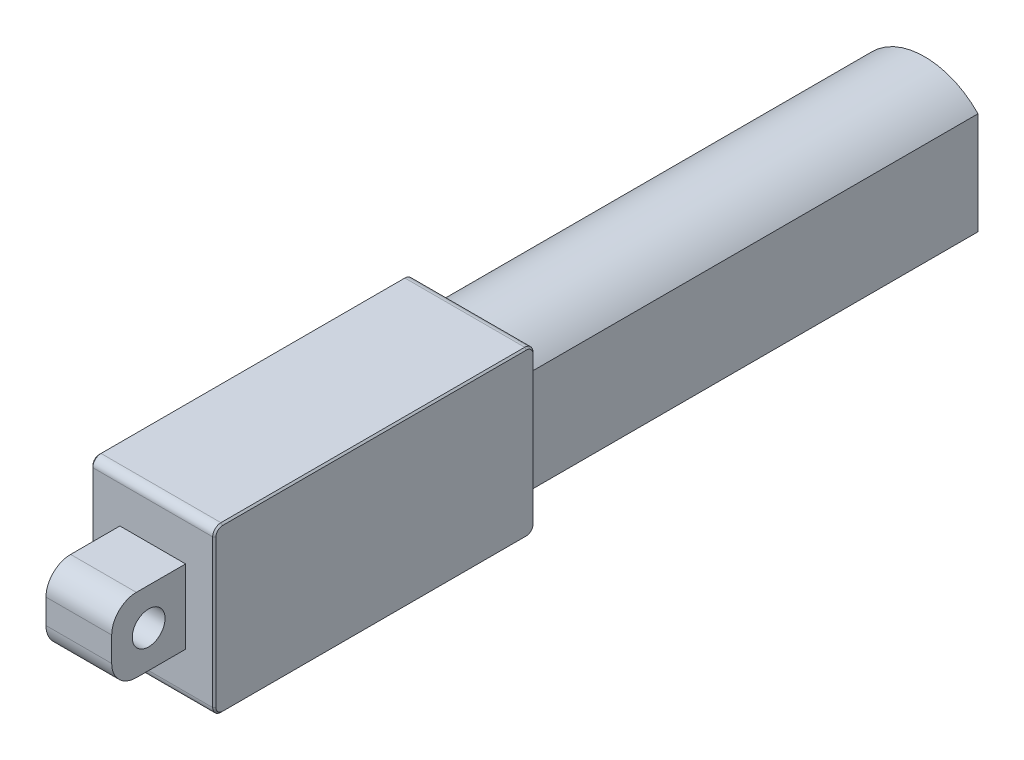
ISO-10303-21;
HEADER;
FILE_DESCRIPTION(('STEP AP214'),'2;1');
FILE_NAME('part.step','',(''),(''),'','','');
FILE_SCHEMA(('AUTOMOTIVE_DESIGN { 1 0 10303 214 1 1 1 1 }'));
ENDSEC;
DATA;
#1=APPLICATION_CONTEXT('core data for automotive mechanical design processes');
#2=APPLICATION_PROTOCOL_DEFINITION('international standard','automotive_design',2000,#1);
#3=PRODUCT_CONTEXT('',#1,'mechanical');
#4=PRODUCT('Part','Part','',(#3));
#5=PRODUCT_RELATED_PRODUCT_CATEGORY('part','',(#4));
#6=PRODUCT_DEFINITION_FORMATION('','',#4);
#7=PRODUCT_DEFINITION_CONTEXT('part definition',#1,'design');
#8=PRODUCT_DEFINITION('design','',#6,#7);
#9=PRODUCT_DEFINITION_SHAPE('','',#8);
#10=(LENGTH_UNIT() NAMED_UNIT(*) SI_UNIT(.MILLI.,.METRE.));
#11=(NAMED_UNIT(*) PLANE_ANGLE_UNIT() SI_UNIT($,.RADIAN.));
#12=(NAMED_UNIT(*) SI_UNIT($,.STERADIAN.) SOLID_ANGLE_UNIT());
#13=UNCERTAINTY_MEASURE_WITH_UNIT(LENGTH_MEASURE(1.E-05),#10,'distance_accuracy_value','');
#14=(GEOMETRIC_REPRESENTATION_CONTEXT(3) GLOBAL_UNCERTAINTY_ASSIGNED_CONTEXT((#13)) GLOBAL_UNIT_ASSIGNED_CONTEXT((#10,
#11,#12)) REPRESENTATION_CONTEXT('',''));
#15=CARTESIAN_POINT('',(0.,0.,0.));
#16=DIRECTION('',(0.,0.,1.));
#17=DIRECTION('',(1.,0.,0.));
#18=AXIS2_PLACEMENT_3D('',#15,#16,#17);
#19=CARTESIAN_POINT('',(0.,0.,-43.5));
#20=DIRECTION('',(0.,0.,1.));
#21=DIRECTION('',(0.,-1.,0.));
#22=AXIS2_PLACEMENT_3D('',#19,#20,#21);
#23=PLANE('',#22);
#24=DIRECTION('',(1.,0.,0.));
#25=VECTOR('',#24,1.);
#26=CARTESIAN_POINT('',(0.,9.,-43.5));
#27=LINE('',#26,#25);
#28=CARTESIAN_POINT('',(4.,9.,-43.5));
#29=VERTEX_POINT('',#28);
#30=CARTESIAN_POINT('',(11.3,9.,-43.5));
#31=VERTEX_POINT('',#30);
#32=EDGE_CURVE('E350',#29,#31,#27,.T.);
#33=ORIENTED_EDGE('',*,*,#32,.T.);
#34=DIRECTION('',(0.,-1.,0.));
#35=VECTOR('',#34,1.);
#36=CARTESIAN_POINT('',(11.3,0.,-43.5));
#37=LINE('',#36,#35);
#38=CARTESIAN_POINT('',(11.3,-9.,-43.5));
#39=VERTEX_POINT('',#38);
#40=EDGE_CURVE('E11',#31,#39,#37,.T.);
#41=ORIENTED_EDGE('',*,*,#40,.T.);
#42=DIRECTION('',(-1.,0.,0.));
#43=VECTOR('',#42,1.);
#44=CARTESIAN_POINT('',(0.,-9.,-43.5));
#45=LINE('',#44,#43);
#46=CARTESIAN_POINT('',(4.,-9.,-43.5));
#47=VERTEX_POINT('',#46);
#48=EDGE_CURVE('E361',#39,#47,#45,.T.);
#49=ORIENTED_EDGE('',*,*,#48,.T.);
#50=CARTESIAN_POINT('',(4.,0.,-43.5));
#51=DIRECTION('',(0.,0.,-1.));
#52=DIRECTION('',(0.,1.,0.));
#53=AXIS2_PLACEMENT_3D('',#50,#51,#52);
#54=CIRCLE('',#53,9.);
#55=CARTESIAN_POINT('',(10.5,-6.22494979899437,-43.5));
#56=VERTEX_POINT('',#55);
#57=EDGE_CURVE('E1081',#56,#47,#54,.T.);
#58=ORIENTED_EDGE('',*,*,#57,.F.);
#59=DIRECTION('',(0.,-1.,0.));
#60=VECTOR('',#59,1.);
#61=CARTESIAN_POINT('',(10.5,6.22494979899436,-43.5));
#62=LINE('',#61,#60);
#63=CARTESIAN_POINT('',(10.5,6.22494979899436,-43.5));
#64=VERTEX_POINT('',#63);
#65=EDGE_CURVE('E248',#64,#56,#62,.T.);
#66=ORIENTED_EDGE('',*,*,#65,.F.);
#67=CARTESIAN_POINT('',(4.,0.,-43.5));
#68=DIRECTION('',(0.,0.,-1.));
#69=DIRECTION('',(0.,1.,0.));
#70=AXIS2_PLACEMENT_3D('',#67,#68,#69);
#71=CIRCLE('',#70,9.);
#72=EDGE_CURVE('E1061',#29,#64,#71,.T.);
#73=ORIENTED_EDGE('',*,*,#72,.F.);
#74=EDGE_LOOP('',(#33,#41,#49,#58,#66,#73));
#75=FACE_BOUND('',#74,.T.);
#76=ADVANCED_FACE('F42',(#75),#23,.F.);
#77=DIRECTION('',(-1.,0.,0.));
#78=VECTOR('',#77,1.);
#79=CARTESIAN_POINT('',(0.,-9.,-43.5));
#80=LINE('',#79,#78);
#81=CARTESIAN_POINT('',(-3.3,-9.,-43.5));
#82=VERTEX_POINT('',#81);
#83=EDGE_CURVE('E357',#47,#82,#80,.T.);
#84=ORIENTED_EDGE('',*,*,#83,.T.);
#85=DIRECTION('',(0.,1.,0.));
#86=VECTOR('',#85,1.);
#87=CARTESIAN_POINT('',(-3.29999999999999,0.,-43.5));
#88=LINE('',#87,#86);
#89=CARTESIAN_POINT('',(-3.29999999999999,9.,-43.5));
#90=VERTEX_POINT('',#89);
#91=EDGE_CURVE('E417',#82,#90,#88,.T.);
#92=ORIENTED_EDGE('',*,*,#91,.T.);
#93=DIRECTION('',(1.,0.,0.));
#94=VECTOR('',#93,1.);
#95=CARTESIAN_POINT('',(0.,9.,-43.5));
#96=LINE('',#95,#94);
#97=EDGE_CURVE('E354',#90,#29,#96,.T.);
#98=ORIENTED_EDGE('',*,*,#97,.T.);
#99=CARTESIAN_POINT('',(-2.5,6.22494979899436,-43.5));
#100=VERTEX_POINT('',#99);
#101=EDGE_CURVE('E1058',#100,#29,#71,.T.);
#102=ORIENTED_EDGE('',*,*,#101,.F.);
#103=DIRECTION('',(0.,1.,0.));
#104=VECTOR('',#103,1.);
#105=CARTESIAN_POINT('',(-2.5,6.22494979899436,-43.5));
#106=LINE('',#105,#104);
#107=CARTESIAN_POINT('',(-2.5,-6.22494979899437,-43.5));
#108=VERTEX_POINT('',#107);
#109=EDGE_CURVE('E1069',#108,#100,#106,.T.);
#110=ORIENTED_EDGE('',*,*,#109,.F.);
#111=EDGE_CURVE('E253',#47,#108,#54,.T.);
#112=ORIENTED_EDGE('',*,*,#111,.F.);
#113=EDGE_LOOP('',(#84,#92,#98,#102,#110,#112));
#114=FACE_BOUND('',#113,.T.);
#115=ADVANCED_FACE('F575',(#114),#23,.F.);
#116=CARTESIAN_POINT('',(8.,-1.5,1.5));
#117=DIRECTION('',(-1.,0.,0.));
#118=DIRECTION('',(0.,0.,1.));
#119=AXIS2_PLACEMENT_3D('',#116,#117,#118);
#120=PLANE('',#119);
#121=CARTESIAN_POINT('',(8.,-1.5,1.5));
#122=DIRECTION('',(1.,0.,0.));
#123=DIRECTION('',(0.,0.,1.));
#124=AXIS2_PLACEMENT_3D('',#121,#122,#123);
#125=CIRCLE('',#124,3.);
#126=CARTESIAN_POINT('',(8.,-1.49999999999998,4.5));
#127=VERTEX_POINT('',#126);
#128=CARTESIAN_POINT('',(8.,-4.5,1.49999999999998));
#129=VERTEX_POINT('',#128);
#130=EDGE_CURVE('E271',#127,#129,#125,.T.);
#131=ORIENTED_EDGE('',*,*,#130,.T.);
#132=DIRECTION('',(0.,0.,-1.));
#133=VECTOR('',#132,1.);
#134=CARTESIAN_POINT('',(8.,-4.5,-4.5));
#135=LINE('',#134,#133);
#136=CARTESIAN_POINT('',(8.,-4.5,-4.5));
#137=VERTEX_POINT('',#136);
#138=EDGE_CURVE('E275',#129,#137,#135,.T.);
#139=ORIENTED_EDGE('',*,*,#138,.T.);
#140=DIRECTION('',(0.,1.,0.));
#141=VECTOR('',#140,1.);
#142=CARTESIAN_POINT('',(8.,4.5,-4.5));
#143=LINE('',#142,#141);
#144=CARTESIAN_POINT('',(8.,4.5,-4.5));
#145=VERTEX_POINT('',#144);
#146=EDGE_CURVE('E279',#137,#145,#143,.T.);
#147=ORIENTED_EDGE('',*,*,#146,.T.);
#148=DIRECTION('',(0.,0.,1.));
#149=VECTOR('',#148,1.);
#150=CARTESIAN_POINT('',(8.,4.5,0.));
#151=LINE('',#150,#149);
#152=CARTESIAN_POINT('',(8.,4.5,1.49999999999998));
#153=VERTEX_POINT('',#152);
#154=EDGE_CURVE('E282',#145,#153,#151,.T.);
#155=ORIENTED_EDGE('',*,*,#154,.T.);
#156=CARTESIAN_POINT('',(8.,1.5,1.5));
#157=DIRECTION('',(1.,0.,0.));
#158=DIRECTION('',(0.,0.,1.));
#159=AXIS2_PLACEMENT_3D('',#156,#157,#158);
#160=CIRCLE('',#159,3.);
#161=CARTESIAN_POINT('',(8.,1.49999999999998,4.5));
#162=VERTEX_POINT('',#161);
#163=EDGE_CURVE('E285',#153,#162,#160,.T.);
#164=ORIENTED_EDGE('',*,*,#163,.T.);
#165=DIRECTION('',(0.,-1.,0.));
#166=VECTOR('',#165,1.);
#167=CARTESIAN_POINT('',(8.,-1.49999999999998,4.5));
#168=LINE('',#167,#166);
#169=EDGE_CURVE('E288',#162,#127,#168,.T.);
#170=ORIENTED_EDGE('',*,*,#169,.T.);
#171=EDGE_LOOP('',(#131,#139,#147,#155,#164,#170));
#172=FACE_BOUND('',#171,.T.);
#173=CARTESIAN_POINT('',(8.,0.,0.));
#174=DIRECTION('',(1.,0.,0.));
#175=DIRECTION('',(0.,0.,-1.));
#176=AXIS2_PLACEMENT_3D('',#173,#174,#175);
#177=CIRCLE('',#176,2.);
#178=CARTESIAN_POINT('',(8.,0.,-2.));
#179=VERTEX_POINT('',#178);
#180=EDGE_CURVE('E261',#179,#179,#177,.T.);
#181=ORIENTED_EDGE('',*,*,#180,.F.);
#182=EDGE_LOOP('',(#181));
#183=FACE_BOUND('',#182,.T.);
#184=ADVANCED_FACE('F633',(#172,#183),#120,.F.);
#185=CARTESIAN_POINT('',(0.,-1.5,1.5));
#186=DIRECTION('',(-1.,0.,0.));
#187=DIRECTION('',(0.,0.,1.));
#188=AXIS2_PLACEMENT_3D('',#185,#186,#187);
#189=PLANE('',#188);
#190=CARTESIAN_POINT('',(0.,-1.5,1.5));
#191=DIRECTION('',(1.,0.,0.));
#192=DIRECTION('',(0.,0.,1.));
#193=AXIS2_PLACEMENT_3D('',#190,#191,#192);
#194=CIRCLE('',#193,3.);
#195=CARTESIAN_POINT('',(0.,-1.49999999999998,4.5));
#196=VERTEX_POINT('',#195);
#197=CARTESIAN_POINT('',(0.,-4.5,1.49999999999998));
#198=VERTEX_POINT('',#197);
#199=EDGE_CURVE('E269',#196,#198,#194,.T.);
#200=ORIENTED_EDGE('',*,*,#199,.F.);
#201=DIRECTION('',(0.,-1.,0.));
#202=VECTOR('',#201,1.);
#203=CARTESIAN_POINT('',(0.,-1.49999999999998,4.5));
#204=LINE('',#203,#202);
#205=CARTESIAN_POINT('',(0.,1.49999999999998,4.5));
#206=VERTEX_POINT('',#205);
#207=EDGE_CURVE('E276',#206,#196,#204,.T.);
#208=ORIENTED_EDGE('',*,*,#207,.F.);
#209=CARTESIAN_POINT('',(0.,1.5,1.5));
#210=DIRECTION('',(1.,0.,0.));
#211=DIRECTION('',(0.,0.,1.));
#212=AXIS2_PLACEMENT_3D('',#209,#210,#211);
#213=CIRCLE('',#212,3.);
#214=CARTESIAN_POINT('',(0.,4.5,1.49999999999998));
#215=VERTEX_POINT('',#214);
#216=EDGE_CURVE('E306',#215,#206,#213,.T.);
#217=ORIENTED_EDGE('',*,*,#216,.F.);
#218=DIRECTION('',(0.,0.,1.));
#219=VECTOR('',#218,1.);
#220=CARTESIAN_POINT('',(0.,4.5,1.49999999999998));
#221=LINE('',#220,#219);
#222=CARTESIAN_POINT('',(0.,4.5,-4.5));
#223=VERTEX_POINT('',#222);
#224=EDGE_CURVE('E303',#223,#215,#221,.T.);
#225=ORIENTED_EDGE('',*,*,#224,.F.);
#226=DIRECTION('',(0.,1.,0.));
#227=VECTOR('',#226,1.);
#228=CARTESIAN_POINT('',(0.,4.5,-4.5));
#229=LINE('',#228,#227);
#230=CARTESIAN_POINT('',(0.,-4.5,-4.5));
#231=VERTEX_POINT('',#230);
#232=EDGE_CURVE('E299',#231,#223,#229,.T.);
#233=ORIENTED_EDGE('',*,*,#232,.F.);
#234=DIRECTION('',(0.,0.,-1.));
#235=VECTOR('',#234,1.);
#236=CARTESIAN_POINT('',(0.,-4.5,-4.5));
#237=LINE('',#236,#235);
#238=EDGE_CURVE('E295',#198,#231,#237,.T.);
#239=ORIENTED_EDGE('',*,*,#238,.F.);
#240=EDGE_LOOP('',(#200,#208,#217,#225,#233,#239));
#241=FACE_BOUND('',#240,.T.);
#242=CARTESIAN_POINT('',(0.,0.,0.));
#243=DIRECTION('',(1.,0.,0.));
#244=DIRECTION('',(0.,0.,-1.));
#245=AXIS2_PLACEMENT_3D('',#242,#243,#244);
#246=CIRCLE('',#245,2.);
#247=CARTESIAN_POINT('',(0.,0.,-2.));
#248=VERTEX_POINT('',#247);
#249=EDGE_CURVE('E256',#248,#248,#246,.T.);
#250=ORIENTED_EDGE('',*,*,#249,.T.);
#251=EDGE_LOOP('',(#250));
#252=FACE_BOUND('',#251,.T.);
#253=ADVANCED_FACE('F655',(#241,#252),#189,.T.);
#254=CARTESIAN_POINT('',(8.,-1.5,1.5));
#255=DIRECTION('',(-1.,0.,0.));
#256=DIRECTION('',(0.,0.,1.));
#257=AXIS2_PLACEMENT_3D('',#254,#255,#256);
#258=CYLINDRICAL_SURFACE('',#257,3.);
#259=ORIENTED_EDGE('',*,*,#199,.T.);
#260=DIRECTION('',(-1.,0.,0.));
#261=VECTOR('',#260,1.);
#262=CARTESIAN_POINT('',(8.,-4.5,1.49999999999998));
#263=LINE('',#262,#261);
#264=EDGE_CURVE('E330',#129,#198,#263,.T.);
#265=ORIENTED_EDGE('',*,*,#264,.F.);
#266=ORIENTED_EDGE('',*,*,#130,.F.);
#267=DIRECTION('',(-1.,0.,0.));
#268=VECTOR('',#267,1.);
#269=CARTESIAN_POINT('',(8.,-1.49999999999998,4.5));
#270=LINE('',#269,#268);
#271=EDGE_CURVE('E291',#127,#196,#270,.T.);
#272=ORIENTED_EDGE('',*,*,#271,.T.);
#273=EDGE_LOOP('',(#259,#265,#266,#272));
#274=FACE_BOUND('',#273,.T.);
#275=ADVANCED_FACE('F659',(#274),#258,.T.);
#276=CARTESIAN_POINT('',(8.,-4.5,-4.5));
#277=DIRECTION('',(0.,1.,0.));
#278=DIRECTION('',(0.,0.,1.));
#279=AXIS2_PLACEMENT_3D('',#276,#277,#278);
#280=PLANE('',#279);
#281=ORIENTED_EDGE('',*,*,#238,.T.);
#282=DIRECTION('',(-1.,0.,0.));
#283=VECTOR('',#282,1.);
#284=CARTESIAN_POINT('',(8.,-4.5,-4.5));
#285=LINE('',#284,#283);
#286=EDGE_CURVE('E326',#137,#231,#285,.T.);
#287=ORIENTED_EDGE('',*,*,#286,.F.);
#288=ORIENTED_EDGE('',*,*,#138,.F.);
#289=ORIENTED_EDGE('',*,*,#264,.T.);
#290=EDGE_LOOP('',(#281,#287,#288,#289));
#291=FACE_BOUND('',#290,.T.);
#292=ADVANCED_FACE('F671',(#291),#280,.F.);
#293=CARTESIAN_POINT('',(8.,4.5,1.49999999999998));
#294=DIRECTION('',(0.,-1.,0.));
#295=DIRECTION('',(0.,0.,-1.));
#296=AXIS2_PLACEMENT_3D('',#293,#294,#295);
#297=PLANE('',#296);
#298=ORIENTED_EDGE('',*,*,#224,.T.);
#299=DIRECTION('',(-1.,0.,0.));
#300=VECTOR('',#299,1.);
#301=CARTESIAN_POINT('',(8.,4.5,1.49999999999998));
#302=LINE('',#301,#300);
#303=EDGE_CURVE('E318',#153,#215,#302,.T.);
#304=ORIENTED_EDGE('',*,*,#303,.F.);
#305=ORIENTED_EDGE('',*,*,#154,.F.);
#306=DIRECTION('',(-1.,0.,0.));
#307=VECTOR('',#306,1.);
#308=CARTESIAN_POINT('',(8.,4.5,-4.5));
#309=LINE('',#308,#307);
#310=EDGE_CURVE('E322',#145,#223,#309,.T.);
#311=ORIENTED_EDGE('',*,*,#310,.T.);
#312=EDGE_LOOP('',(#298,#304,#305,#311));
#313=FACE_BOUND('',#312,.T.);
#314=ADVANCED_FACE('F667',(#313),#297,.F.);
#315=CARTESIAN_POINT('',(8.,1.5,1.5));
#316=DIRECTION('',(-1.,0.,0.));
#317=DIRECTION('',(0.,0.,1.));
#318=AXIS2_PLACEMENT_3D('',#315,#316,#317);
#319=CYLINDRICAL_SURFACE('',#318,3.);
#320=ORIENTED_EDGE('',*,*,#216,.T.);
#321=DIRECTION('',(-1.,0.,0.));
#322=VECTOR('',#321,1.);
#323=CARTESIAN_POINT('',(8.,1.49999999999998,4.5));
#324=LINE('',#323,#322);
#325=EDGE_CURVE('E314',#162,#206,#324,.T.);
#326=ORIENTED_EDGE('',*,*,#325,.F.);
#327=ORIENTED_EDGE('',*,*,#163,.F.);
#328=ORIENTED_EDGE('',*,*,#303,.T.);
#329=EDGE_LOOP('',(#320,#326,#327,#328));
#330=FACE_BOUND('',#329,.T.);
#331=ADVANCED_FACE('F663',(#330),#319,.T.);
#332=CARTESIAN_POINT('',(8.,-1.49999999999998,4.5));
#333=DIRECTION('',(0.,0.,-1.));
#334=DIRECTION('',(-1.,0.,0.));
#335=AXIS2_PLACEMENT_3D('',#332,#333,#334);
#336=PLANE('',#335);
#337=ORIENTED_EDGE('',*,*,#207,.T.);
#338=ORIENTED_EDGE('',*,*,#271,.F.);
#339=ORIENTED_EDGE('',*,*,#169,.F.);
#340=ORIENTED_EDGE('',*,*,#325,.T.);
#341=EDGE_LOOP('',(#337,#338,#339,#340));
#342=FACE_BOUND('',#341,.T.);
#343=ADVANCED_FACE('F651',(#342),#336,.F.);
#344=CARTESIAN_POINT('',(8.,0.,0.));
#345=DIRECTION('',(-1.,0.,0.));
#346=DIRECTION('',(0.,0.,1.));
#347=AXIS2_PLACEMENT_3D('',#344,#345,#346);
#348=CYLINDRICAL_SURFACE('',#347,2.);
#349=ORIENTED_EDGE('',*,*,#180,.T.);
#350=EDGE_LOOP('',(#349));
#351=FACE_BOUND('',#350,.T.);
#352=ORIENTED_EDGE('',*,*,#249,.F.);
#353=EDGE_LOOP('',(#352));
#354=FACE_BOUND('',#353,.T.);
#355=ADVANCED_FACE('F648',(#351,#354),#348,.F.);
#356=CARTESIAN_POINT('',(11.5,-10.,-43.5));
#357=DIRECTION('',(-1.,0.,0.));
#358=DIRECTION('',(0.,0.,1.));
#359=AXIS2_PLACEMENT_3D('',#356,#357,#358);
#360=PLANE('',#359);
#361=CARTESIAN_POINT('',(11.5,-9.00000000000001,-5.5));
#362=DIRECTION('',(-1.,0.,0.));
#363=DIRECTION('',(0.,0.,1.));
#364=AXIS2_PLACEMENT_3D('',#361,#362,#363);
#365=CIRCLE('',#364,0.799999999999993);
#366=CARTESIAN_POINT('',(11.5,-9.00000000000001,-4.7));
#367=VERTEX_POINT('',#366);
#368=CARTESIAN_POINT('',(11.5,-9.8,-5.5));
#369=VERTEX_POINT('',#368);
#370=EDGE_CURVE('E69',#367,#369,#365,.F.);
#371=ORIENTED_EDGE('',*,*,#370,.T.);
#372=DIRECTION('',(0.,0.,-1.));
#373=VECTOR('',#372,1.);
#374=CARTESIAN_POINT('',(11.5,-9.79999999999999,-43.5));
#375=LINE('',#374,#373);
#376=CARTESIAN_POINT('',(11.5,-9.8,-42.5));
#377=VERTEX_POINT('',#376);
#378=EDGE_CURVE('E53',#369,#377,#375,.T.);
#379=ORIENTED_EDGE('',*,*,#378,.T.);
#380=CARTESIAN_POINT('',(11.5,-9.,-42.5));
#381=DIRECTION('',(-1.,0.,0.));
#382=DIRECTION('',(0.,0.,1.));
#383=AXIS2_PLACEMENT_3D('',#380,#381,#382);
#384=CIRCLE('',#383,0.799999999999995);
#385=CARTESIAN_POINT('',(11.5,-9.,-43.3));
#386=VERTEX_POINT('',#385);
#387=EDGE_CURVE('E461',#377,#386,#384,.F.);
#388=ORIENTED_EDGE('',*,*,#387,.T.);
#389=DIRECTION('',(0.,1.,0.));
#390=VECTOR('',#389,1.);
#391=CARTESIAN_POINT('',(11.5,-10.,-43.3));
#392=LINE('',#391,#390);
#393=CARTESIAN_POINT('',(11.5,9.,-43.3));
#394=VERTEX_POINT('',#393);
#395=EDGE_CURVE('E456',#386,#394,#392,.T.);
#396=ORIENTED_EDGE('',*,*,#395,.T.);
#397=CARTESIAN_POINT('',(11.5,9.,-42.5));
#398=DIRECTION('',(-1.,0.,0.));
#399=DIRECTION('',(0.,0.,1.));
#400=AXIS2_PLACEMENT_3D('',#397,#398,#399);
#401=CIRCLE('',#400,0.799999999999995);
#402=CARTESIAN_POINT('',(11.5,9.8,-42.5));
#403=VERTEX_POINT('',#402);
#404=EDGE_CURVE('E450',#394,#403,#401,.F.);
#405=ORIENTED_EDGE('',*,*,#404,.T.);
#406=DIRECTION('',(0.,0.,1.));
#407=VECTOR('',#406,1.);
#408=CARTESIAN_POINT('',(11.5,9.8,-43.5));
#409=LINE('',#408,#407);
#410=CARTESIAN_POINT('',(11.5,9.79999999999999,-5.5));
#411=VERTEX_POINT('',#410);
#412=EDGE_CURVE('E444',#403,#411,#409,.T.);
#413=ORIENTED_EDGE('',*,*,#412,.T.);
#414=CARTESIAN_POINT('',(11.5,9.,-5.5));
#415=DIRECTION('',(-1.,0.,0.));
#416=DIRECTION('',(0.,0.,1.));
#417=AXIS2_PLACEMENT_3D('',#414,#415,#416);
#418=CIRCLE('',#417,0.799999999999994);
#419=CARTESIAN_POINT('',(11.5,9.,-4.7));
#420=VERTEX_POINT('',#419);
#421=EDGE_CURVE('E447',#411,#420,#418,.F.);
#422=ORIENTED_EDGE('',*,*,#421,.T.);
#423=DIRECTION('',(0.,-1.,0.));
#424=VECTOR('',#423,1.);
#425=CARTESIAN_POINT('',(11.5,-9.00000000000001,-4.7));
#426=LINE('',#425,#424);
#427=EDGE_CURVE('E453',#420,#367,#426,.T.);
#428=ORIENTED_EDGE('',*,*,#427,.T.);
#429=EDGE_LOOP('',(#371,#379,#388,#396,#405,#413,#422,#428));
#430=FACE_BOUND('',#429,.T.);
#431=ADVANCED_FACE('F535',(#430),#360,.F.);
#432=CARTESIAN_POINT('',(-3.5,-10.,-43.5));
#433=DIRECTION('',(0.,1.,0.));
#434=DIRECTION('',(0.,0.,1.));
#435=AXIS2_PLACEMENT_3D('',#432,#433,#434);
#436=PLANE('',#435);
#437=DIRECTION('',(-1.,0.,0.));
#438=VECTOR('',#437,1.);
#439=CARTESIAN_POINT('',(-3.5,-10.,-5.5));
#440=LINE('',#439,#438);
#441=CARTESIAN_POINT('',(11.3,-10.,-5.5));
#442=VERTEX_POINT('',#441);
#443=CARTESIAN_POINT('',(-3.3,-10.,-5.5));
#444=VERTEX_POINT('',#443);
#445=EDGE_CURVE('E338',#442,#444,#440,.T.);
#446=ORIENTED_EDGE('',*,*,#445,.T.);
#447=DIRECTION('',(0.,0.,-1.));
#448=VECTOR('',#447,1.);
#449=CARTESIAN_POINT('',(-3.3,-10.,-43.5));
#450=LINE('',#449,#448);
#451=CARTESIAN_POINT('',(-3.3,-10.,-42.5));
#452=VERTEX_POINT('',#451);
#453=EDGE_CURVE('E401',#444,#452,#450,.T.);
#454=ORIENTED_EDGE('',*,*,#453,.T.);
#455=DIRECTION('',(-1.,0.,0.));
#456=VECTOR('',#455,1.);
#457=CARTESIAN_POINT('',(-3.5,-10.,-42.5));
#458=LINE('',#457,#456);
#459=CARTESIAN_POINT('',(11.3,-10.,-42.5));
#460=VERTEX_POINT('',#459);
#461=EDGE_CURVE('E334',#452,#460,#458,.F.);
#462=ORIENTED_EDGE('',*,*,#461,.T.);
#463=DIRECTION('',(0.,0.,1.));
#464=VECTOR('',#463,1.);
#465=CARTESIAN_POINT('',(11.3,-10.,-43.5));
#466=LINE('',#465,#464);
#467=EDGE_CURVE('E397',#460,#442,#466,.T.);
#468=ORIENTED_EDGE('',*,*,#467,.T.);
#469=EDGE_LOOP('',(#446,#454,#462,#468));
#470=FACE_BOUND('',#469,.T.);
#471=ADVANCED_FACE('F551',(#470),#436,.F.);
#472=CARTESIAN_POINT('',(-3.5,10.,-43.5));
#473=DIRECTION('',(1.,0.,0.));
#474=DIRECTION('',(0.,1.,0.));
#475=AXIS2_PLACEMENT_3D('',#472,#473,#474);
#476=PLANE('',#475);
#477=CARTESIAN_POINT('',(-3.5,-9.,-42.5));
#478=DIRECTION('',(1.,0.,0.));
#479=DIRECTION('',(0.,1.,0.));
#480=AXIS2_PLACEMENT_3D('',#477,#478,#479);
#481=CIRCLE('',#480,0.799999999999993);
#482=CARTESIAN_POINT('',(-3.5,-9.,-43.3));
#483=VERTEX_POINT('',#482);
#484=CARTESIAN_POINT('',(-3.5,-9.79999999999999,-42.5));
#485=VERTEX_POINT('',#484);
#486=EDGE_CURVE('E390',#483,#485,#481,.F.);
#487=ORIENTED_EDGE('',*,*,#486,.T.);
#488=DIRECTION('',(0.,0.,1.));
#489=VECTOR('',#488,1.);
#490=CARTESIAN_POINT('',(-3.5,-9.8,-43.5));
#491=LINE('',#490,#489);
#492=CARTESIAN_POINT('',(-3.5,-9.8,-5.5));
#493=VERTEX_POINT('',#492);
#494=EDGE_CURVE('E393',#485,#493,#491,.T.);
#495=ORIENTED_EDGE('',*,*,#494,.T.);
#496=CARTESIAN_POINT('',(-3.5,-9.00000000000001,-5.5));
#497=DIRECTION('',(1.,0.,0.));
#498=DIRECTION('',(0.,1.,0.));
#499=AXIS2_PLACEMENT_3D('',#496,#497,#498);
#500=CIRCLE('',#499,0.799999999999994);
#501=CARTESIAN_POINT('',(-3.5,-9.00000000000001,-4.70000000000001));
#502=VERTEX_POINT('',#501);
#503=EDGE_CURVE('E387',#493,#502,#500,.F.);
#504=ORIENTED_EDGE('',*,*,#503,.T.);
#505=DIRECTION('',(0.,1.,0.));
#506=VECTOR('',#505,1.);
#507=CARTESIAN_POINT('',(-3.5,9.,-4.70000000000001));
#508=LINE('',#507,#506);
#509=CARTESIAN_POINT('',(-3.5,9.,-4.7));
#510=VERTEX_POINT('',#509);
#511=EDGE_CURVE('E381',#502,#510,#508,.T.);
#512=ORIENTED_EDGE('',*,*,#511,.T.);
#513=CARTESIAN_POINT('',(-3.5,9.,-5.5));
#514=DIRECTION('',(1.,0.,0.));
#515=DIRECTION('',(0.,1.,0.));
#516=AXIS2_PLACEMENT_3D('',#513,#514,#515);
#517=CIRCLE('',#516,0.799999999999995);
#518=CARTESIAN_POINT('',(-3.5,9.79999999999999,-5.5));
#519=VERTEX_POINT('',#518);
#520=EDGE_CURVE('E375',#510,#519,#517,.F.);
#521=ORIENTED_EDGE('',*,*,#520,.T.);
#522=DIRECTION('',(0.,0.,-1.));
#523=VECTOR('',#522,1.);
#524=CARTESIAN_POINT('',(-3.5,9.8,-43.5));
#525=LINE('',#524,#523);
#526=CARTESIAN_POINT('',(-3.5,9.8,-42.5));
#527=VERTEX_POINT('',#526);
#528=EDGE_CURVE('E372',#519,#527,#525,.T.);
#529=ORIENTED_EDGE('',*,*,#528,.T.);
#530=CARTESIAN_POINT('',(-3.5,9.,-42.5));
#531=DIRECTION('',(1.,0.,0.));
#532=DIRECTION('',(0.,1.,0.));
#533=AXIS2_PLACEMENT_3D('',#530,#531,#532);
#534=CIRCLE('',#533,0.799999999999995);
#535=CARTESIAN_POINT('',(-3.5,9.,-43.3));
#536=VERTEX_POINT('',#535);
#537=EDGE_CURVE('E378',#527,#536,#534,.F.);
#538=ORIENTED_EDGE('',*,*,#537,.T.);
#539=DIRECTION('',(0.,-1.,0.));
#540=VECTOR('',#539,1.);
#541=CARTESIAN_POINT('',(-3.5,10.,-43.3));
#542=LINE('',#541,#540);
#543=EDGE_CURVE('E384',#536,#483,#542,.T.);
#544=ORIENTED_EDGE('',*,*,#543,.T.);
#545=EDGE_LOOP('',(#487,#495,#504,#512,#521,#529,#538,#544));
#546=FACE_BOUND('',#545,.T.);
#547=ADVANCED_FACE('F567',(#546),#476,.F.);
#548=CARTESIAN_POINT('',(4.,10.,-43.5));
#549=DIRECTION('',(0.,-1.,0.));
#550=DIRECTION('',(0.,0.,-1.));
#551=AXIS2_PLACEMENT_3D('',#548,#549,#550);
#552=PLANE('',#551);
#553=DIRECTION('',(1.,0.,0.));
#554=VECTOR('',#553,1.);
#555=CARTESIAN_POINT('',(4.,10.,-42.5));
#556=LINE('',#555,#554);
#557=CARTESIAN_POINT('',(11.3,10.,-42.5));
#558=VERTEX_POINT('',#557);
#559=CARTESIAN_POINT('',(-3.29999999999999,10.,-42.5));
#560=VERTEX_POINT('',#559);
#561=EDGE_CURVE('E368',#558,#560,#556,.F.);
#562=ORIENTED_EDGE('',*,*,#561,.T.);
#563=DIRECTION('',(0.,0.,1.));
#564=VECTOR('',#563,1.);
#565=CARTESIAN_POINT('',(-3.29999999999999,10.,-43.5));
#566=LINE('',#565,#564);
#567=CARTESIAN_POINT('',(-3.29999999999999,10.,-5.5));
#568=VERTEX_POINT('',#567);
#569=EDGE_CURVE('E441',#560,#568,#566,.T.);
#570=ORIENTED_EDGE('',*,*,#569,.T.);
#571=DIRECTION('',(1.,0.,0.));
#572=VECTOR('',#571,1.);
#573=CARTESIAN_POINT('',(11.5,10.,-5.5));
#574=LINE('',#573,#572);
#575=CARTESIAN_POINT('',(11.3,10.,-5.5));
#576=VERTEX_POINT('',#575);
#577=EDGE_CURVE('E364',#568,#576,#574,.T.);
#578=ORIENTED_EDGE('',*,*,#577,.T.);
#579=DIRECTION('',(0.,0.,-1.));
#580=VECTOR('',#579,1.);
#581=CARTESIAN_POINT('',(11.3,10.,-43.5));
#582=LINE('',#581,#580);
#583=EDGE_CURVE('E438',#576,#558,#582,.T.);
#584=ORIENTED_EDGE('',*,*,#583,.T.);
#585=EDGE_LOOP('',(#562,#570,#578,#584));
#586=FACE_BOUND('',#585,.T.);
#587=ADVANCED_FACE('F591',(#586),#552,.F.);
#588=CARTESIAN_POINT('',(0.,0.,-4.5));
#589=DIRECTION('',(0.,0.,1.));
#590=DIRECTION('',(0.,-1.,0.));
#591=AXIS2_PLACEMENT_3D('',#588,#589,#590);
#592=PLANE('',#591);
#593=ORIENTED_EDGE('',*,*,#286,.T.);
#594=ORIENTED_EDGE('',*,*,#232,.T.);
#595=ORIENTED_EDGE('',*,*,#310,.F.);
#596=ORIENTED_EDGE('',*,*,#146,.F.);
#597=EDGE_LOOP('',(#593,#594,#595,#596));
#598=FACE_BOUND('',#597,.T.);
#599=DIRECTION('',(1.,0.,0.));
#600=VECTOR('',#599,1.);
#601=CARTESIAN_POINT('',(-3.5,9.,-4.5));
#602=LINE('',#601,#600);
#603=CARTESIAN_POINT('',(11.3,9.,-4.5));
#604=VERTEX_POINT('',#603);
#605=CARTESIAN_POINT('',(-3.29999999999999,9.,-4.5));
#606=VERTEX_POINT('',#605);
#607=EDGE_CURVE('E342',#604,#606,#602,.F.);
#608=ORIENTED_EDGE('',*,*,#607,.T.);
#609=DIRECTION('',(0.,-1.,0.));
#610=VECTOR('',#609,1.);
#611=CARTESIAN_POINT('',(-3.3,-9.00000000000001,-4.5));
#612=LINE('',#611,#610);
#613=CARTESIAN_POINT('',(-3.3,-9.00000000000001,-4.5));
#614=VERTEX_POINT('',#613);
#615=EDGE_CURVE('E423',#606,#614,#612,.T.);
#616=ORIENTED_EDGE('',*,*,#615,.T.);
#617=DIRECTION('',(-1.,0.,0.));
#618=VECTOR('',#617,1.);
#619=CARTESIAN_POINT('',(11.5,-9.00000000000001,-4.5));
#620=LINE('',#619,#618);
#621=CARTESIAN_POINT('',(11.3,-9.00000000000001,-4.5));
#622=VERTEX_POINT('',#621);
#623=EDGE_CURVE('E346',#614,#622,#620,.F.);
#624=ORIENTED_EDGE('',*,*,#623,.T.);
#625=DIRECTION('',(0.,1.,0.));
#626=VECTOR('',#625,1.);
#627=CARTESIAN_POINT('',(11.3,9.,-4.5));
#628=LINE('',#627,#626);
#629=EDGE_CURVE('E420',#622,#604,#628,.T.);
#630=ORIENTED_EDGE('',*,*,#629,.T.);
#631=EDGE_LOOP('',(#608,#616,#624,#630));
#632=FACE_BOUND('',#631,.T.);
#633=ADVANCED_FACE('F607',(#598,#632),#592,.T.);
#634=CARTESIAN_POINT('',(4.,0.,-98.5));
#635=DIRECTION('',(0.,0.,1.));
#636=DIRECTION('',(0.,-1.,0.));
#637=AXIS2_PLACEMENT_3D('',#634,#635,#636);
#638=CYLINDRICAL_SURFACE('',#637,9.);
#639=ORIENTED_EDGE('',*,*,#57,.T.);
#640=ORIENTED_EDGE('',*,*,#111,.T.);
#641=DIRECTION('',(0.,0.,1.));
#642=VECTOR('',#641,1.);
#643=CARTESIAN_POINT('',(-2.5,-6.22494979899437,-98.5));
#644=LINE('',#643,#642);
#645=CARTESIAN_POINT('',(-2.5,-6.22494979899437,-98.5));
#646=VERTEX_POINT('',#645);
#647=EDGE_CURVE('E231',#646,#108,#644,.T.);
#648=ORIENTED_EDGE('',*,*,#647,.F.);
#649=CARTESIAN_POINT('',(4.,0.,-98.5));
#650=DIRECTION('',(0.,0.,-1.));
#651=DIRECTION('',(0.,1.,0.));
#652=AXIS2_PLACEMENT_3D('',#649,#650,#651);
#653=CIRCLE('',#652,9.);
#654=CARTESIAN_POINT('',(10.5,-6.22494979899436,-98.5));
#655=VERTEX_POINT('',#654);
#656=EDGE_CURVE('E238',#655,#646,#653,.T.);
#657=ORIENTED_EDGE('',*,*,#656,.F.);
#658=DIRECTION('',(0.,0.,1.));
#659=VECTOR('',#658,1.);
#660=CARTESIAN_POINT('',(10.5,-6.22494979899436,-98.5));
#661=LINE('',#660,#659);
#662=EDGE_CURVE('E1073',#655,#56,#661,.T.);
#663=ORIENTED_EDGE('',*,*,#662,.T.);
#664=EDGE_LOOP('',(#639,#640,#648,#657,#663));
#665=FACE_BOUND('',#664,.T.);
#666=ADVANCED_FACE('F251',(#665),#638,.T.);
#667=CARTESIAN_POINT('',(-2.5,6.22494979899437,-98.5));
#668=DIRECTION('',(1.,0.,0.));
#669=DIRECTION('',(0.,0.,-1.));
#670=AXIS2_PLACEMENT_3D('',#667,#668,#669);
#671=PLANE('',#670);
#672=ORIENTED_EDGE('',*,*,#109,.T.);
#673=DIRECTION('',(0.,0.,1.));
#674=VECTOR('',#673,1.);
#675=CARTESIAN_POINT('',(-2.5,6.22494979899437,-98.5));
#676=LINE('',#675,#674);
#677=CARTESIAN_POINT('',(-2.5,6.22494979899437,-98.5));
#678=VERTEX_POINT('',#677);
#679=EDGE_CURVE('E233',#678,#100,#676,.T.);
#680=ORIENTED_EDGE('',*,*,#679,.F.);
#681=DIRECTION('',(0.,1.,0.));
#682=VECTOR('',#681,1.);
#683=CARTESIAN_POINT('',(-2.5,6.22494979899437,-98.5));
#684=LINE('',#683,#682);
#685=EDGE_CURVE('E226',#646,#678,#684,.T.);
#686=ORIENTED_EDGE('',*,*,#685,.F.);
#687=ORIENTED_EDGE('',*,*,#647,.T.);
#688=EDGE_LOOP('',(#672,#680,#686,#687));
#689=FACE_BOUND('',#688,.T.);
#690=ADVANCED_FACE('F229',(#689),#671,.F.);
#691=CARTESIAN_POINT('',(4.,0.,-98.5));
#692=DIRECTION('',(0.,0.,1.));
#693=DIRECTION('',(0.,-1.,0.));
#694=AXIS2_PLACEMENT_3D('',#691,#692,#693);
#695=CYLINDRICAL_SURFACE('',#694,9.);
#696=ORIENTED_EDGE('',*,*,#101,.T.);
#697=ORIENTED_EDGE('',*,*,#72,.T.);
#698=DIRECTION('',(0.,0.,1.));
#699=VECTOR('',#698,1.);
#700=CARTESIAN_POINT('',(10.5,6.22494979899437,-98.5));
#701=LINE('',#700,#699);
#702=CARTESIAN_POINT('',(10.5,6.22494979899437,-98.5));
#703=VERTEX_POINT('',#702);
#704=EDGE_CURVE('E263',#703,#64,#701,.T.);
#705=ORIENTED_EDGE('',*,*,#704,.F.);
#706=CARTESIAN_POINT('',(4.,0.,-98.5));
#707=DIRECTION('',(0.,0.,-1.));
#708=DIRECTION('',(0.,1.,0.));
#709=AXIS2_PLACEMENT_3D('',#706,#707,#708);
#710=CIRCLE('',#709,9.);
#711=EDGE_CURVE('E237',#678,#703,#710,.T.);
#712=ORIENTED_EDGE('',*,*,#711,.F.);
#713=ORIENTED_EDGE('',*,*,#679,.T.);
#714=EDGE_LOOP('',(#696,#697,#705,#712,#713));
#715=FACE_BOUND('',#714,.T.);
#716=ADVANCED_FACE('F899',(#715),#695,.T.);
#717=CARTESIAN_POINT('',(10.5,6.22494979899437,-98.5));
#718=DIRECTION('',(-1.,0.,0.));
#719=DIRECTION('',(0.,0.,1.));
#720=AXIS2_PLACEMENT_3D('',#717,#718,#719);
#721=PLANE('',#720);
#722=ORIENTED_EDGE('',*,*,#65,.T.);
#723=ORIENTED_EDGE('',*,*,#662,.F.);
#724=DIRECTION('',(0.,-1.,0.));
#725=VECTOR('',#724,1.);
#726=CARTESIAN_POINT('',(10.5,6.22494979899437,-98.5));
#727=LINE('',#726,#725);
#728=EDGE_CURVE('E243',#703,#655,#727,.T.);
#729=ORIENTED_EDGE('',*,*,#728,.F.);
#730=ORIENTED_EDGE('',*,*,#704,.T.);
#731=EDGE_LOOP('',(#722,#723,#729,#730));
#732=FACE_BOUND('',#731,.T.);
#733=ADVANCED_FACE('F889',(#732),#721,.F.);
#734=CARTESIAN_POINT('',(4.,0.,-98.5));
#735=DIRECTION('',(0.,0.,-1.));
#736=DIRECTION('',(0.,1.,0.));
#737=AXIS2_PLACEMENT_3D('',#734,#735,#736);
#738=PLANE('',#737);
#739=CARTESIAN_POINT('',(4.,0.,-98.5));
#740=DIRECTION('',(0.,0.,-1.));
#741=DIRECTION('',(0.,1.,0.));
#742=AXIS2_PLACEMENT_3D('',#739,#740,#741);
#743=CIRCLE('',#742,4.5);
#744=CARTESIAN_POINT('',(4.,4.5,-98.5));
#745=VERTEX_POINT('',#744);
#746=EDGE_CURVE('E496',#745,#745,#743,.T.);
#747=ORIENTED_EDGE('',*,*,#746,.F.);
#748=EDGE_LOOP('',(#747));
#749=FACE_BOUND('',#748,.T.);
#750=ORIENTED_EDGE('',*,*,#656,.T.);
#751=ORIENTED_EDGE('',*,*,#685,.T.);
#752=ORIENTED_EDGE('',*,*,#711,.T.);
#753=ORIENTED_EDGE('',*,*,#728,.T.);
#754=EDGE_LOOP('',(#750,#751,#752,#753));
#755=FACE_BOUND('',#754,.T.);
#756=ADVANCED_FACE('F241',(#749,#755),#738,.T.);
#757=CARTESIAN_POINT('',(4.,0.,-43.5));
#758=DIRECTION('',(0.,0.,-1.));
#759=DIRECTION('',(0.,1.,0.));
#760=AXIS2_PLACEMENT_3D('',#757,#758,#759);
#761=CYLINDRICAL_SURFACE('',#760,4.5);
#762=CARTESIAN_POINT('',(4.,0.,-43.5));
#763=DIRECTION('',(0.,0.,-1.));
#764=DIRECTION('',(0.,1.,0.));
#765=AXIS2_PLACEMENT_3D('',#762,#763,#764);
#766=CIRCLE('',#765,4.5);
#767=CARTESIAN_POINT('',(4.,4.5,-43.5));
#768=VERTEX_POINT('',#767);
#769=EDGE_CURVE('E1085',#768,#768,#766,.T.);
#770=ORIENTED_EDGE('',*,*,#769,.F.);
#771=EDGE_LOOP('',(#770));
#772=FACE_BOUND('',#771,.T.);
#773=ORIENTED_EDGE('',*,*,#746,.T.);
#774=EDGE_LOOP('',(#773));
#775=FACE_BOUND('',#774,.T.);
#776=ADVANCED_FACE('F870',(#772,#775),#761,.F.);
#777=CARTESIAN_POINT('',(4.,0.,-43.5));
#778=DIRECTION('',(0.,0.,-1.));
#779=DIRECTION('',(0.,1.,0.));
#780=AXIS2_PLACEMENT_3D('',#777,#778,#779);
#781=PLANE('',#780);
#782=ORIENTED_EDGE('',*,*,#769,.T.);
#783=EDGE_LOOP('',(#782));
#784=FACE_BOUND('',#783,.T.);
#785=ADVANCED_FACE('F682',(#784),#781,.T.);
#786=CARTESIAN_POINT('',(-3.5,-9.00000000000001,-5.5));
#787=DIRECTION('',(1.,0.,0.));
#788=DIRECTION('',(0.,0.,-1.));
#789=AXIS2_PLACEMENT_3D('',#786,#787,#788);
#790=CYLINDRICAL_SURFACE('',#789,1.);
#791=ORIENTED_EDGE('',*,*,#623,.F.);
#792=CARTESIAN_POINT('',(-3.3,-9.00000000000001,-5.5));
#793=DIRECTION('',(1.,0.,0.));
#794=DIRECTION('',(0.,0.,-1.));
#795=AXIS2_PLACEMENT_3D('',#792,#793,#794);
#796=CIRCLE('',#795,1.);
#797=EDGE_CURVE('E414',#614,#444,#796,.T.);
#798=ORIENTED_EDGE('',*,*,#797,.T.);
#799=ORIENTED_EDGE('',*,*,#445,.F.);
#800=CARTESIAN_POINT('',(11.3,-9.00000000000001,-5.5));
#801=DIRECTION('',(-1.,0.,0.));
#802=DIRECTION('',(0.,0.,1.));
#803=AXIS2_PLACEMENT_3D('',#800,#801,#802);
#804=CIRCLE('',#803,1.);
#805=EDGE_CURVE('E411',#442,#622,#804,.T.);
#806=ORIENTED_EDGE('',*,*,#805,.T.);
#807=EDGE_LOOP('',(#791,#798,#799,#806));
#808=FACE_BOUND('',#807,.T.);
#809=ADVANCED_FACE('F679',(#808),#790,.T.);
#810=CARTESIAN_POINT('',(0.,-9.,-42.5));
#811=DIRECTION('',(-1.,0.,0.));
#812=DIRECTION('',(0.,0.,1.));
#813=AXIS2_PLACEMENT_3D('',#810,#811,#812);
#814=CYLINDRICAL_SURFACE('',#813,1.);
#815=ORIENTED_EDGE('',*,*,#461,.F.);
#816=CARTESIAN_POINT('',(-3.3,-9.,-42.5));
#817=DIRECTION('',(1.,0.,0.));
#818=DIRECTION('',(0.,0.,-1.));
#819=AXIS2_PLACEMENT_3D('',#816,#817,#818);
#820=CIRCLE('',#819,1.);
#821=EDGE_CURVE('E408',#452,#82,#820,.T.);
#822=ORIENTED_EDGE('',*,*,#821,.T.);
#823=ORIENTED_EDGE('',*,*,#83,.F.);
#824=ORIENTED_EDGE('',*,*,#48,.F.);
#825=CARTESIAN_POINT('',(11.3,-9.,-42.5));
#826=DIRECTION('',(-1.,0.,0.));
#827=DIRECTION('',(0.,0.,1.));
#828=AXIS2_PLACEMENT_3D('',#825,#826,#827);
#829=CIRCLE('',#828,1.);
#830=EDGE_CURVE('E405',#39,#460,#829,.T.);
#831=ORIENTED_EDGE('',*,*,#830,.T.);
#832=EDGE_LOOP('',(#815,#822,#823,#824,#831));
#833=FACE_BOUND('',#832,.T.);
#834=ADVANCED_FACE('F548',(#833),#814,.T.);
#835=CARTESIAN_POINT('',(0.,9.,-42.5));
#836=DIRECTION('',(1.,0.,0.));
#837=DIRECTION('',(0.,0.,-1.));
#838=AXIS2_PLACEMENT_3D('',#835,#836,#837);
#839=CYLINDRICAL_SURFACE('',#838,1.);
#840=ORIENTED_EDGE('',*,*,#97,.F.);
#841=CARTESIAN_POINT('',(-3.29999999999999,9.,-42.5));
#842=DIRECTION('',(1.,0.,0.));
#843=DIRECTION('',(0.,0.,-1.));
#844=AXIS2_PLACEMENT_3D('',#841,#842,#843);
#845=CIRCLE('',#844,1.);
#846=EDGE_CURVE('E429',#90,#560,#845,.T.);
#847=ORIENTED_EDGE('',*,*,#846,.T.);
#848=ORIENTED_EDGE('',*,*,#561,.F.);
#849=CARTESIAN_POINT('',(11.3,9.,-42.5));
#850=DIRECTION('',(-1.,0.,0.));
#851=DIRECTION('',(0.,0.,1.));
#852=AXIS2_PLACEMENT_3D('',#849,#850,#851);
#853=CIRCLE('',#852,1.);
#854=EDGE_CURVE('E426',#558,#31,#853,.T.);
#855=ORIENTED_EDGE('',*,*,#854,.T.);
#856=ORIENTED_EDGE('',*,*,#32,.F.);
#857=EDGE_LOOP('',(#840,#847,#848,#855,#856));
#858=FACE_BOUND('',#857,.T.);
#859=ADVANCED_FACE('F587',(#858),#839,.T.);
#860=CARTESIAN_POINT('',(4.,9.,-5.5));
#861=DIRECTION('',(-1.,0.,0.));
#862=DIRECTION('',(0.,0.,1.));
#863=AXIS2_PLACEMENT_3D('',#860,#861,#862);
#864=CYLINDRICAL_SURFACE('',#863,1.);
#865=ORIENTED_EDGE('',*,*,#577,.F.);
#866=CARTESIAN_POINT('',(-3.29999999999999,9.,-5.5));
#867=DIRECTION('',(1.,0.,0.));
#868=DIRECTION('',(0.,0.,-1.));
#869=AXIS2_PLACEMENT_3D('',#866,#867,#868);
#870=CIRCLE('',#869,1.);
#871=EDGE_CURVE('E435',#568,#606,#870,.T.);
#872=ORIENTED_EDGE('',*,*,#871,.T.);
#873=ORIENTED_EDGE('',*,*,#607,.F.);
#874=CARTESIAN_POINT('',(11.3,9.,-5.5));
#875=DIRECTION('',(-1.,0.,0.));
#876=DIRECTION('',(0.,0.,1.));
#877=AXIS2_PLACEMENT_3D('',#874,#875,#876);
#878=CIRCLE('',#877,1.);
#879=EDGE_CURVE('E432',#604,#576,#878,.T.);
#880=ORIENTED_EDGE('',*,*,#879,.T.);
#881=EDGE_LOOP('',(#865,#872,#873,#880));
#882=FACE_BOUND('',#881,.T.);
#883=ADVANCED_FACE('F605',(#882),#864,.T.);
#884=CARTESIAN_POINT('',(-3.29999999999999,10.,-43.5));
#885=DIRECTION('',(0.707106781186548,-0.707106781186548,0.));
#886=DIRECTION('',(0.,0.,1.));
#887=AXIS2_PLACEMENT_3D('',#884,#885,#886);
#888=PLANE('',#887);
#889=DIRECTION('',(-0.707106781186548,-0.707106781186548,0.));
#890=VECTOR('',#889,1.);
#891=CARTESIAN_POINT('',(-3.29999999999999,10.,-5.5));
#892=LINE('',#891,#890);
#893=EDGE_CURVE('E488',#568,#519,#892,.T.);
#894=ORIENTED_EDGE('',*,*,#893,.F.);
#895=ORIENTED_EDGE('',*,*,#569,.F.);
#896=DIRECTION('',(0.707106781186548,0.707106781186548,0.));
#897=VECTOR('',#896,1.);
#898=CARTESIAN_POINT('',(-3.5,9.8,-42.5));
#899=LINE('',#898,#897);
#900=EDGE_CURVE('E492',#527,#560,#899,.T.);
#901=ORIENTED_EDGE('',*,*,#900,.F.);
#902=ORIENTED_EDGE('',*,*,#528,.F.);
#903=EDGE_LOOP('',(#894,#895,#901,#902));
#904=FACE_BOUND('',#903,.T.);
#905=ADVANCED_FACE('F595',(#904),#888,.F.);
#906=CARTESIAN_POINT('',(-3.5,9.,-42.5));
#907=DIRECTION('',(1.,0.,0.));
#908=DIRECTION('',(0.,0.,-1.));
#909=AXIS2_PLACEMENT_3D('',#906,#907,#908);
#910=CONICAL_SURFACE('',#909,0.799999999999995,0.785398163397446);
#911=ORIENTED_EDGE('',*,*,#900,.T.);
#912=ORIENTED_EDGE('',*,*,#846,.F.);
#913=DIRECTION('',(0.707106781186548,0.,-0.707106781186548));
#914=VECTOR('',#913,1.);
#915=CARTESIAN_POINT('',(-3.5,9.,-43.3));
#916=LINE('',#915,#914);
#917=EDGE_CURVE('E484',#536,#90,#916,.T.);
#918=ORIENTED_EDGE('',*,*,#917,.F.);
#919=ORIENTED_EDGE('',*,*,#537,.F.);
#920=EDGE_LOOP('',(#911,#912,#918,#919));
#921=FACE_BOUND('',#920,.T.);
#922=ADVANCED_FACE('F583',(#921),#910,.T.);
#923=CARTESIAN_POINT('',(-3.5,9.,-5.5));
#924=DIRECTION('',(1.,0.,0.));
#925=DIRECTION('',(0.,0.,-1.));
#926=AXIS2_PLACEMENT_3D('',#923,#924,#925);
#927=CONICAL_SURFACE('',#926,0.799999999999995,0.785398163397446);
#928=ORIENTED_EDGE('',*,*,#893,.T.);
#929=ORIENTED_EDGE('',*,*,#520,.F.);
#930=DIRECTION('',(-0.707106781186549,0.,-0.707106781186546));
#931=VECTOR('',#930,1.);
#932=CARTESIAN_POINT('',(-3.29999999999999,9.,-4.5));
#933=LINE('',#932,#931);
#934=EDGE_CURVE('E480',#606,#510,#933,.T.);
#935=ORIENTED_EDGE('',*,*,#934,.F.);
#936=ORIENTED_EDGE('',*,*,#871,.F.);
#937=EDGE_LOOP('',(#928,#929,#935,#936));
#938=FACE_BOUND('',#937,.T.);
#939=ADVANCED_FACE('F601',(#938),#927,.T.);
#940=CARTESIAN_POINT('',(-3.29999999999999,0.,-43.5));
#941=DIRECTION('',(0.707106781186546,0.,0.707106781186549));
#942=DIRECTION('',(0.,1.,0.));
#943=AXIS2_PLACEMENT_3D('',#940,#941,#942);
#944=PLANE('',#943);
#945=ORIENTED_EDGE('',*,*,#917,.T.);
#946=ORIENTED_EDGE('',*,*,#91,.F.);
#947=DIRECTION('',(0.707106781186548,0.,-0.707106781186548));
#948=VECTOR('',#947,1.);
#949=CARTESIAN_POINT('',(-3.5,-9.,-43.3));
#950=LINE('',#949,#948);
#951=EDGE_CURVE('E476',#483,#82,#950,.T.);
#952=ORIENTED_EDGE('',*,*,#951,.F.);
#953=ORIENTED_EDGE('',*,*,#543,.F.);
#954=EDGE_LOOP('',(#945,#946,#952,#953));
#955=FACE_BOUND('',#954,.T.);
#956=ADVANCED_FACE('F578',(#955),#944,.F.);
#957=CARTESIAN_POINT('',(-3.5,10.,-4.70000000000001));
#958=DIRECTION('',(-0.707106781186555,0.,0.70710678118654));
#959=DIRECTION('',(0.,-1.,0.));
#960=AXIS2_PLACEMENT_3D('',#957,#958,#959);
#961=PLANE('',#960);
#962=ORIENTED_EDGE('',*,*,#934,.T.);
#963=ORIENTED_EDGE('',*,*,#511,.F.);
#964=DIRECTION('',(-0.707106781186541,0.,-0.707106781186555));
#965=VECTOR('',#964,1.);
#966=CARTESIAN_POINT('',(-3.3,-9.00000000000001,-4.5));
#967=LINE('',#966,#965);
#968=EDGE_CURVE('E472',#614,#502,#967,.T.);
#969=ORIENTED_EDGE('',*,*,#968,.F.);
#970=ORIENTED_EDGE('',*,*,#615,.F.);
#971=EDGE_LOOP('',(#962,#963,#969,#970));
#972=FACE_BOUND('',#971,.T.);
#973=ADVANCED_FACE('F706',(#972),#961,.T.);
#974=CARTESIAN_POINT('',(-3.5,-9.,-42.5));
#975=DIRECTION('',(1.,0.,0.));
#976=DIRECTION('',(0.,0.,-1.));
#977=AXIS2_PLACEMENT_3D('',#974,#975,#976);
#978=CONICAL_SURFACE('',#977,0.799999999999993,0.78539816339745);
#979=ORIENTED_EDGE('',*,*,#951,.T.);
#980=ORIENTED_EDGE('',*,*,#821,.F.);
#981=DIRECTION('',(0.707106781186548,-0.707106781186548,0.));
#982=VECTOR('',#981,1.);
#983=CARTESIAN_POINT('',(-3.5,-9.79999999999999,-42.5));
#984=LINE('',#983,#982);
#985=EDGE_CURVE('E469',#485,#452,#984,.T.);
#986=ORIENTED_EDGE('',*,*,#985,.F.);
#987=ORIENTED_EDGE('',*,*,#486,.F.);
#988=EDGE_LOOP('',(#979,#980,#986,#987));
#989=FACE_BOUND('',#988,.T.);
#990=ADVANCED_FACE('F572',(#989),#978,.T.);
#991=CARTESIAN_POINT('',(-3.5,-9.00000000000001,-5.5));
#992=DIRECTION('',(1.,0.,0.));
#993=DIRECTION('',(0.,0.,-1.));
#994=AXIS2_PLACEMENT_3D('',#991,#992,#993);
#995=CONICAL_SURFACE('',#994,0.799999999999994,0.785398163397448);
#996=ORIENTED_EDGE('',*,*,#968,.T.);
#997=ORIENTED_EDGE('',*,*,#503,.F.);
#998=DIRECTION('',(-0.707106781186551,0.707106781186544,0.));
#999=VECTOR('',#998,1.);
#1000=CARTESIAN_POINT('',(-3.3,-10.,-5.5));
#1001=LINE('',#1000,#999);
#1002=EDGE_CURVE('E466',#444,#493,#1001,.T.);
#1003=ORIENTED_EDGE('',*,*,#1002,.F.);
#1004=ORIENTED_EDGE('',*,*,#797,.F.);
#1005=EDGE_LOOP('',(#996,#997,#1003,#1004));
#1006=FACE_BOUND('',#1005,.T.);
#1007=ADVANCED_FACE('F563',(#1006),#995,.T.);
#1008=CARTESIAN_POINT('',(-3.5,-9.8,-43.5));
#1009=DIRECTION('',(0.707106781186544,0.707106781186551,0.));
#1010=DIRECTION('',(0.,0.,1.));
#1011=AXIS2_PLACEMENT_3D('',#1008,#1009,#1010);
#1012=PLANE('',#1011);
#1013=ORIENTED_EDGE('',*,*,#985,.T.);
#1014=ORIENTED_EDGE('',*,*,#453,.F.);
#1015=ORIENTED_EDGE('',*,*,#1002,.T.);
#1016=ORIENTED_EDGE('',*,*,#494,.F.);
#1017=EDGE_LOOP('',(#1013,#1014,#1015,#1016));
#1018=FACE_BOUND('',#1017,.T.);
#1019=ADVANCED_FACE('F556',(#1018),#1012,.F.);
#1020=CARTESIAN_POINT('',(11.5,9.8,-43.5));
#1021=DIRECTION('',(-0.707106781186544,-0.707106781186551,0.));
#1022=DIRECTION('',(0.,0.,1.));
#1023=AXIS2_PLACEMENT_3D('',#1020,#1021,#1022);
#1024=PLANE('',#1023);
#1025=DIRECTION('',(-0.707106781186551,0.707106781186544,0.));
#1026=VECTOR('',#1025,1.);
#1027=CARTESIAN_POINT('',(11.5,9.79999999999999,-5.5));
#1028=LINE('',#1027,#1026);
#1029=EDGE_CURVE('E517',#411,#576,#1028,.T.);
#1030=ORIENTED_EDGE('',*,*,#1029,.F.);
#1031=ORIENTED_EDGE('',*,*,#412,.F.);
#1032=DIRECTION('',(0.707106781186551,-0.707106781186544,0.));
#1033=VECTOR('',#1032,1.);
#1034=CARTESIAN_POINT('',(11.3,10.,-42.5));
#1035=LINE('',#1034,#1033);
#1036=EDGE_CURVE('E47',#558,#403,#1035,.T.);
#1037=ORIENTED_EDGE('',*,*,#1036,.F.);
#1038=ORIENTED_EDGE('',*,*,#583,.F.);
#1039=EDGE_LOOP('',(#1030,#1031,#1037,#1038));
#1040=FACE_BOUND('',#1039,.T.);
#1041=ADVANCED_FACE('F45',(#1040),#1024,.F.);
#1042=CARTESIAN_POINT('',(11.5,9.,-42.5));
#1043=DIRECTION('',(-1.,0.,0.));
#1044=DIRECTION('',(0.,0.,1.));
#1045=AXIS2_PLACEMENT_3D('',#1042,#1043,#1044);
#1046=CONICAL_SURFACE('',#1045,0.799999999999995,0.785398163397446);
#1047=ORIENTED_EDGE('',*,*,#1036,.T.);
#1048=ORIENTED_EDGE('',*,*,#404,.F.);
#1049=DIRECTION('',(0.707106781186548,0.,0.707106781186548));
#1050=VECTOR('',#1049,1.);
#1051=CARTESIAN_POINT('',(11.3,9.,-43.5));
#1052=LINE('',#1051,#1050);
#1053=EDGE_CURVE('E514',#31,#394,#1052,.T.);
#1054=ORIENTED_EDGE('',*,*,#1053,.F.);
#1055=ORIENTED_EDGE('',*,*,#854,.F.);
#1056=EDGE_LOOP('',(#1047,#1048,#1054,#1055));
#1057=FACE_BOUND('',#1056,.T.);
#1058=ADVANCED_FACE('F530',(#1057),#1046,.T.);
#1059=CARTESIAN_POINT('',(11.5,9.,-5.5));
#1060=DIRECTION('',(-1.,0.,0.));
#1061=DIRECTION('',(0.,0.,1.));
#1062=AXIS2_PLACEMENT_3D('',#1059,#1060,#1061);
#1063=CONICAL_SURFACE('',#1062,0.799999999999994,0.785398163397448);
#1064=ORIENTED_EDGE('',*,*,#1029,.T.);
#1065=ORIENTED_EDGE('',*,*,#879,.F.);
#1066=DIRECTION('',(-0.707106781186548,0.,0.707106781186548));
#1067=VECTOR('',#1066,1.);
#1068=CARTESIAN_POINT('',(11.5,9.,-4.7));
#1069=LINE('',#1068,#1067);
#1070=EDGE_CURVE('E510',#420,#604,#1069,.T.);
#1071=ORIENTED_EDGE('',*,*,#1070,.F.);
#1072=ORIENTED_EDGE('',*,*,#421,.F.);
#1073=EDGE_LOOP('',(#1064,#1065,#1071,#1072));
#1074=FACE_BOUND('',#1073,.T.);
#1075=ADVANCED_FACE('F773',(#1074),#1063,.T.);
#1076=CARTESIAN_POINT('',(11.3,0.,-43.5));
#1077=DIRECTION('',(-0.707106781186549,0.,0.707106781186546));
#1078=DIRECTION('',(0.,-1.,0.));
#1079=AXIS2_PLACEMENT_3D('',#1076,#1077,#1078);
#1080=PLANE('',#1079);
#1081=ORIENTED_EDGE('',*,*,#1053,.T.);
#1082=ORIENTED_EDGE('',*,*,#395,.F.);
#1083=DIRECTION('',(0.707106781186548,0.,0.707106781186548));
#1084=VECTOR('',#1083,1.);
#1085=CARTESIAN_POINT('',(11.3,-9.,-43.5));
#1086=LINE('',#1085,#1084);
#1087=EDGE_CURVE('E506',#39,#386,#1086,.T.);
#1088=ORIENTED_EDGE('',*,*,#1087,.F.);
#1089=ORIENTED_EDGE('',*,*,#40,.F.);
#1090=EDGE_LOOP('',(#1081,#1082,#1088,#1089));
#1091=FACE_BOUND('',#1090,.T.);
#1092=ADVANCED_FACE('F540',(#1091),#1080,.F.);
#1093=CARTESIAN_POINT('',(11.5,-10.,-4.7));
#1094=DIRECTION('',(0.70710678118654,0.,0.707106781186555));
#1095=DIRECTION('',(0.,1.,0.));
#1096=AXIS2_PLACEMENT_3D('',#1093,#1094,#1095);
#1097=PLANE('',#1096);
#1098=ORIENTED_EDGE('',*,*,#1070,.T.);
#1099=ORIENTED_EDGE('',*,*,#629,.F.);
#1100=DIRECTION('',(-0.707106781186555,0.,0.70710678118654));
#1101=VECTOR('',#1100,1.);
#1102=CARTESIAN_POINT('',(11.5,-9.00000000000001,-4.7));
#1103=LINE('',#1102,#1101);
#1104=EDGE_CURVE('E502',#367,#622,#1103,.T.);
#1105=ORIENTED_EDGE('',*,*,#1104,.F.);
#1106=ORIENTED_EDGE('',*,*,#427,.F.);
#1107=EDGE_LOOP('',(#1098,#1099,#1105,#1106));
#1108=FACE_BOUND('',#1107,.T.);
#1109=ADVANCED_FACE('F612',(#1108),#1097,.T.);
#1110=CARTESIAN_POINT('',(11.5,-9.,-42.5));
#1111=DIRECTION('',(-1.,0.,0.));
#1112=DIRECTION('',(0.,0.,1.));
#1113=AXIS2_PLACEMENT_3D('',#1110,#1111,#1112);
#1114=CONICAL_SURFACE('',#1113,0.799999999999995,0.785398163397446);
#1115=ORIENTED_EDGE('',*,*,#1087,.T.);
#1116=ORIENTED_EDGE('',*,*,#387,.F.);
#1117=DIRECTION('',(0.707106781186551,0.707106781186544,0.));
#1118=VECTOR('',#1117,1.);
#1119=CARTESIAN_POINT('',(11.3,-10.,-42.5));
#1120=LINE('',#1119,#1118);
#1121=EDGE_CURVE('E61',#460,#377,#1120,.T.);
#1122=ORIENTED_EDGE('',*,*,#1121,.F.);
#1123=ORIENTED_EDGE('',*,*,#830,.F.);
#1124=EDGE_LOOP('',(#1115,#1116,#1122,#1123));
#1125=FACE_BOUND('',#1124,.T.);
#1126=ADVANCED_FACE('F544',(#1125),#1114,.T.);
#1127=CARTESIAN_POINT('',(11.5,-9.00000000000001,-5.5));
#1128=DIRECTION('',(-1.,0.,0.));
#1129=DIRECTION('',(0.,0.,1.));
#1130=AXIS2_PLACEMENT_3D('',#1127,#1128,#1129);
#1131=CONICAL_SURFACE('',#1130,0.799999999999993,0.78539816339745);
#1132=ORIENTED_EDGE('',*,*,#1104,.T.);
#1133=ORIENTED_EDGE('',*,*,#805,.F.);
#1134=DIRECTION('',(-0.707106781186548,-0.707106781186548,0.));
#1135=VECTOR('',#1134,1.);
#1136=CARTESIAN_POINT('',(11.5,-9.8,-5.5));
#1137=LINE('',#1136,#1135);
#1138=EDGE_CURVE('E497',#369,#442,#1137,.T.);
#1139=ORIENTED_EDGE('',*,*,#1138,.F.);
#1140=ORIENTED_EDGE('',*,*,#370,.F.);
#1141=EDGE_LOOP('',(#1132,#1133,#1139,#1140));
#1142=FACE_BOUND('',#1141,.T.);
#1143=ADVANCED_FACE('F616',(#1142),#1131,.T.);
#1144=CARTESIAN_POINT('',(11.3,-10.,-43.5));
#1145=DIRECTION('',(-0.707106781186548,0.707106781186548,0.));
#1146=DIRECTION('',(0.,0.,1.));
#1147=AXIS2_PLACEMENT_3D('',#1144,#1145,#1146);
#1148=PLANE('',#1147);
#1149=ORIENTED_EDGE('',*,*,#1121,.T.);
#1150=ORIENTED_EDGE('',*,*,#378,.F.);
#1151=ORIENTED_EDGE('',*,*,#1138,.T.);
#1152=ORIENTED_EDGE('',*,*,#467,.F.);
#1153=EDGE_LOOP('',(#1149,#1150,#1151,#1152));
#1154=FACE_BOUND('',#1153,.T.);
#1155=ADVANCED_FACE('F618',(#1154),#1148,.F.);
#1156=CLOSED_SHELL('',(#76,#115,#184,#253,#275,#292,#314,#331,#343,#355,#431,#471,#547,#587,
#633,#666,#690,#716,#733,#756,#776,#785,#809,#834,#859,#883,#905,#922,#939,#956,#973,#990,#1007,
#1019,#1041,#1058,#1075,#1092,#1109,#1126,#1143,#1155));
#1157=MANIFOLD_SOLID_BREP('B2',#1156);
#1158=ADVANCED_BREP_SHAPE_REPRESENTATION('',(#18,#1157),#14);
#1159=SHAPE_DEFINITION_REPRESENTATION(#9,#1158);
ENDSEC;
END-ISO-10303-21;
